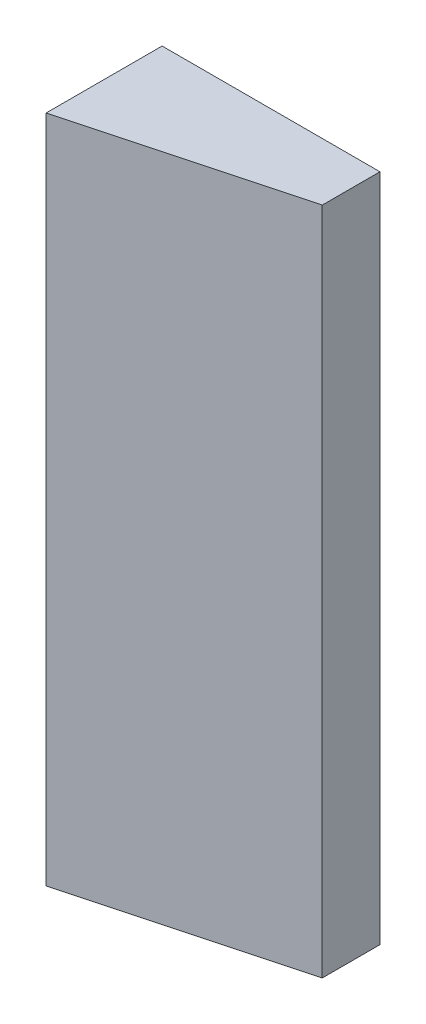
ISO-10303-21;
HEADER;
FILE_DESCRIPTION(('STEP AP214'),'2;1');
FILE_NAME('part.step','',(''),(''),'','','');
FILE_SCHEMA(('AUTOMOTIVE_DESIGN { 1 0 10303 214 1 1 1 1 }'));
ENDSEC;
DATA;
#1=APPLICATION_CONTEXT('core data for automotive mechanical design processes');
#2=APPLICATION_PROTOCOL_DEFINITION('international standard','automotive_design',2000,#1);
#3=PRODUCT_CONTEXT('',#1,'mechanical');
#4=PRODUCT('Part','Part','',(#3));
#5=PRODUCT_RELATED_PRODUCT_CATEGORY('part','',(#4));
#6=PRODUCT_DEFINITION_FORMATION('','',#4);
#7=PRODUCT_DEFINITION_CONTEXT('part definition',#1,'design');
#8=PRODUCT_DEFINITION('design','',#6,#7);
#9=PRODUCT_DEFINITION_SHAPE('','',#8);
#10=(LENGTH_UNIT() NAMED_UNIT(*) SI_UNIT(.MILLI.,.METRE.));
#11=(NAMED_UNIT(*) PLANE_ANGLE_UNIT() SI_UNIT($,.RADIAN.));
#12=(NAMED_UNIT(*) SI_UNIT($,.STERADIAN.) SOLID_ANGLE_UNIT());
#13=UNCERTAINTY_MEASURE_WITH_UNIT(LENGTH_MEASURE(1.E-05),#10,'distance_accuracy_value','');
#14=(GEOMETRIC_REPRESENTATION_CONTEXT(3) GLOBAL_UNCERTAINTY_ASSIGNED_CONTEXT((#13)) GLOBAL_UNIT_ASSIGNED_CONTEXT((#10,
#11,#12)) REPRESENTATION_CONTEXT('',''));
#15=CARTESIAN_POINT('',(0.,0.,0.));
#16=DIRECTION('',(0.,0.,1.));
#17=DIRECTION('',(1.,0.,0.));
#18=AXIS2_PLACEMENT_3D('',#15,#16,#17);
#19=CARTESIAN_POINT('',(0.,-23.2,4.));
#20=DIRECTION('',(0.,1.,0.));
#21=DIRECTION('',(0.,0.,1.));
#22=AXIS2_PLACEMENT_3D('',#19,#20,#21);
#23=PLANE('',#22);
#24=DIRECTION('',(1.,0.,0.));
#25=VECTOR('',#24,1.);
#26=CARTESIAN_POINT('',(0.,-23.2,0.));
#27=LINE('',#26,#25);
#28=CARTESIAN_POINT('',(-7.55,-23.2,0.));
#29=VERTEX_POINT('',#28);
#30=CARTESIAN_POINT('',(7.55000000000001,-23.2,0.));
#31=VERTEX_POINT('',#30);
#32=EDGE_CURVE('E128',#29,#31,#27,.T.);
#33=ORIENTED_EDGE('',*,*,#32,.T.);
#34=DIRECTION('',(0.,0.,-1.));
#35=VECTOR('',#34,1.);
#36=CARTESIAN_POINT('',(7.55000000000001,-23.2,4.));
#37=LINE('',#36,#35);
#38=CARTESIAN_POINT('',(7.55000000000001,-23.2,4.));
#39=VERTEX_POINT('',#38);
#40=EDGE_CURVE('E11',#39,#31,#37,.T.);
#41=ORIENTED_EDGE('',*,*,#40,.F.);
#42=DIRECTION('',(-0.96592582628907,0.,0.258819045102514));
#43=VECTOR('',#42,1.);
#44=CARTESIAN_POINT('',(7.55000000000001,-23.2,4.));
#45=LINE('',#44,#43);
#46=CARTESIAN_POINT('',(-7.55,-23.2,8.04603280570985));
#47=VERTEX_POINT('',#46);
#48=EDGE_CURVE('E105',#39,#47,#45,.T.);
#49=ORIENTED_EDGE('',*,*,#48,.T.);
#50=DIRECTION('',(0.,0.,-1.));
#51=VECTOR('',#50,1.);
#52=CARTESIAN_POINT('',(-7.55,-23.2,4.));
#53=LINE('',#52,#51);
#54=EDGE_CURVE('E58',#47,#29,#53,.T.);
#55=ORIENTED_EDGE('',*,*,#54,.T.);
#56=EDGE_LOOP('',(#33,#41,#49,#55));
#57=FACE_BOUND('',#56,.T.);
#58=ADVANCED_FACE('F41',(#57),#23,.F.);
#59=CARTESIAN_POINT('',(7.55000000000001,0.,4.));
#60=DIRECTION('',(-1.,0.,0.));
#61=DIRECTION('',(0.,-1.,0.));
#62=AXIS2_PLACEMENT_3D('',#59,#60,#61);
#63=PLANE('',#62);
#64=DIRECTION('',(0.,1.,0.));
#65=VECTOR('',#64,1.);
#66=CARTESIAN_POINT('',(7.55000000000001,0.,0.));
#67=LINE('',#66,#65);
#68=CARTESIAN_POINT('',(7.55000000000001,23.2,0.));
#69=VERTEX_POINT('',#68);
#70=EDGE_CURVE('E131',#31,#69,#67,.T.);
#71=ORIENTED_EDGE('',*,*,#70,.T.);
#72=DIRECTION('',(0.,0.,-1.));
#73=VECTOR('',#72,1.);
#74=CARTESIAN_POINT('',(7.55000000000001,23.2,4.));
#75=LINE('',#74,#73);
#76=CARTESIAN_POINT('',(7.55000000000001,23.2,4.));
#77=VERTEX_POINT('',#76);
#78=EDGE_CURVE('E50',#77,#69,#75,.T.);
#79=ORIENTED_EDGE('',*,*,#78,.F.);
#80=DIRECTION('',(0.,1.,0.));
#81=VECTOR('',#80,1.);
#82=CARTESIAN_POINT('',(7.55000000000001,0.,4.));
#83=LINE('',#82,#81);
#84=EDGE_CURVE('E102',#39,#77,#83,.T.);
#85=ORIENTED_EDGE('',*,*,#84,.F.);
#86=ORIENTED_EDGE('',*,*,#40,.T.);
#87=EDGE_LOOP('',(#71,#79,#85,#86));
#88=FACE_BOUND('',#87,.T.);
#89=ADVANCED_FACE('F180',(#88),#63,.F.);
#90=CARTESIAN_POINT('',(0.,23.2,4.));
#91=DIRECTION('',(0.,1.,0.));
#92=DIRECTION('',(0.,0.,1.));
#93=AXIS2_PLACEMENT_3D('',#90,#91,#92);
#94=PLANE('',#93);
#95=DIRECTION('',(1.,0.,0.));
#96=VECTOR('',#95,1.);
#97=CARTESIAN_POINT('',(0.,23.2,0.));
#98=LINE('',#97,#96);
#99=CARTESIAN_POINT('',(-7.55,23.2,0.));
#100=VERTEX_POINT('',#99);
#101=EDGE_CURVE('E89',#100,#69,#98,.T.);
#102=ORIENTED_EDGE('',*,*,#101,.F.);
#103=DIRECTION('',(0.,0.,-1.));
#104=VECTOR('',#103,1.);
#105=CARTESIAN_POINT('',(-7.55,23.2,4.));
#106=LINE('',#105,#104);
#107=CARTESIAN_POINT('',(-7.55,23.2,8.04603280570985));
#108=VERTEX_POINT('',#107);
#109=EDGE_CURVE('E66',#108,#100,#106,.T.);
#110=ORIENTED_EDGE('',*,*,#109,.F.);
#111=DIRECTION('',(-0.96592582628907,0.,0.258819045102514));
#112=VECTOR('',#111,1.);
#113=CARTESIAN_POINT('',(7.55000000000001,23.2,4.));
#114=LINE('',#113,#112);
#115=EDGE_CURVE('E86',#77,#108,#114,.T.);
#116=ORIENTED_EDGE('',*,*,#115,.F.);
#117=ORIENTED_EDGE('',*,*,#78,.T.);
#118=EDGE_LOOP('',(#102,#110,#116,#117));
#119=FACE_BOUND('',#118,.T.);
#120=ADVANCED_FACE('F84',(#119),#94,.T.);
#121=CARTESIAN_POINT('',(-7.55,0.,4.));
#122=DIRECTION('',(-1.,0.,0.));
#123=DIRECTION('',(0.,0.,1.));
#124=AXIS2_PLACEMENT_3D('',#121,#122,#123);
#125=PLANE('',#124);
#126=DIRECTION('',(0.,1.,0.));
#127=VECTOR('',#126,1.);
#128=CARTESIAN_POINT('',(-7.55,0.,0.));
#129=LINE('',#128,#127);
#130=EDGE_CURVE('E127',#29,#100,#129,.T.);
#131=ORIENTED_EDGE('',*,*,#130,.F.);
#132=ORIENTED_EDGE('',*,*,#54,.F.);
#133=DIRECTION('',(0.,-1.,0.));
#134=VECTOR('',#133,1.);
#135=CARTESIAN_POINT('',(-7.55,38.8326703241922,8.04603280570985));
#136=LINE('',#135,#134);
#137=EDGE_CURVE('E94',#108,#47,#136,.T.);
#138=ORIENTED_EDGE('',*,*,#137,.F.);
#139=ORIENTED_EDGE('',*,*,#109,.T.);
#140=EDGE_LOOP('',(#131,#132,#138,#139));
#141=FACE_BOUND('',#140,.T.);
#142=ADVANCED_FACE('F95',(#141),#125,.T.);
#143=CARTESIAN_POINT('',(0.,0.,0.));
#144=DIRECTION('',(0.,0.,1.));
#145=DIRECTION('',(1.,0.,0.));
#146=AXIS2_PLACEMENT_3D('',#143,#144,#145);
#147=PLANE('',#146);
#148=CARTESIAN_POINT('',(-4.55,20.2,0.));
#149=DIRECTION('',(0.,0.,1.));
#150=DIRECTION('',(1.,0.,0.));
#151=AXIS2_PLACEMENT_3D('',#148,#149,#150);
#152=CIRCLE('',#151,0.899999999999998);
#153=CARTESIAN_POINT('',(-3.65,20.2,0.));
#154=VERTEX_POINT('',#153);
#155=EDGE_CURVE('E44',#154,#154,#152,.T.);
#156=ORIENTED_EDGE('',*,*,#155,.T.);
#157=EDGE_LOOP('',(#156));
#158=FACE_BOUND('',#157,.T.);
#159=CARTESIAN_POINT('',(4.55,20.2,0.));
#160=DIRECTION('',(0.,0.,1.));
#161=DIRECTION('',(1.,0.,0.));
#162=AXIS2_PLACEMENT_3D('',#159,#160,#161);
#163=CIRCLE('',#162,0.899999999999998);
#164=CARTESIAN_POINT('',(5.45,20.2,0.));
#165=VERTEX_POINT('',#164);
#166=EDGE_CURVE('E150',#165,#165,#163,.T.);
#167=ORIENTED_EDGE('',*,*,#166,.T.);
#168=EDGE_LOOP('',(#167));
#169=FACE_BOUND('',#168,.T.);
#170=CARTESIAN_POINT('',(4.55,-20.2,0.));
#171=DIRECTION('',(0.,0.,1.));
#172=DIRECTION('',(1.,0.,0.));
#173=AXIS2_PLACEMENT_3D('',#170,#171,#172);
#174=CIRCLE('',#173,0.899999999999998);
#175=CARTESIAN_POINT('',(5.45,-20.2,0.));
#176=VERTEX_POINT('',#175);
#177=EDGE_CURVE('E147',#176,#176,#174,.T.);
#178=ORIENTED_EDGE('',*,*,#177,.T.);
#179=EDGE_LOOP('',(#178));
#180=FACE_BOUND('',#179,.T.);
#181=CARTESIAN_POINT('',(-4.55,-20.2,0.));
#182=DIRECTION('',(0.,0.,1.));
#183=DIRECTION('',(1.,0.,0.));
#184=AXIS2_PLACEMENT_3D('',#181,#182,#183);
#185=CIRCLE('',#184,0.899999999999998);
#186=CARTESIAN_POINT('',(-3.65,-20.2,0.));
#187=VERTEX_POINT('',#186);
#188=EDGE_CURVE('E132',#187,#187,#185,.T.);
#189=ORIENTED_EDGE('',*,*,#188,.T.);
#190=EDGE_LOOP('',(#189));
#191=FACE_BOUND('',#190,.T.);
#192=ORIENTED_EDGE('',*,*,#32,.F.);
#193=ORIENTED_EDGE('',*,*,#130,.T.);
#194=ORIENTED_EDGE('',*,*,#101,.T.);
#195=ORIENTED_EDGE('',*,*,#70,.F.);
#196=EDGE_LOOP('',(#192,#193,#194,#195));
#197=FACE_BOUND('',#196,.T.);
#198=ADVANCED_FACE('F159',(#158,#169,#180,#191,#197),#147,.F.);
#199=CARTESIAN_POINT('',(-4.55,-20.2,4.));
#200=DIRECTION('',(0.,0.,1.));
#201=DIRECTION('',(1.,0.,0.));
#202=AXIS2_PLACEMENT_3D('',#199,#200,#201);
#203=CYLINDRICAL_SURFACE('',#202,0.899999999999998);
#204=CARTESIAN_POINT('',(-4.55,-20.2,4.));
#205=DIRECTION('',(0.,0.,1.));
#206=DIRECTION('',(1.,0.,0.));
#207=AXIS2_PLACEMENT_3D('',#204,#205,#206);
#208=CIRCLE('',#207,0.899999999999999);
#209=CARTESIAN_POINT('',(-3.65,-20.2,4.));
#210=VERTEX_POINT('',#209);
#211=EDGE_CURVE('E98',#210,#210,#208,.T.);
#212=ORIENTED_EDGE('',*,*,#211,.T.);
#213=EDGE_LOOP('',(#212));
#214=FACE_BOUND('',#213,.T.);
#215=ORIENTED_EDGE('',*,*,#188,.F.);
#216=EDGE_LOOP('',(#215));
#217=FACE_BOUND('',#216,.T.);
#218=ADVANCED_FACE('F188',(#214,#217),#203,.F.);
#219=CARTESIAN_POINT('',(4.55,-20.2,4.));
#220=DIRECTION('',(0.,0.,1.));
#221=DIRECTION('',(1.,0.,0.));
#222=AXIS2_PLACEMENT_3D('',#219,#220,#221);
#223=CYLINDRICAL_SURFACE('',#222,0.899999999999998);
#224=CARTESIAN_POINT('',(4.55,-20.2,4.));
#225=DIRECTION('',(0.,0.,1.));
#226=DIRECTION('',(1.,0.,0.));
#227=AXIS2_PLACEMENT_3D('',#224,#225,#226);
#228=CIRCLE('',#227,0.899999999999999);
#229=CARTESIAN_POINT('',(5.45,-20.2,4.));
#230=VERTEX_POINT('',#229);
#231=EDGE_CURVE('E118',#230,#230,#228,.T.);
#232=ORIENTED_EDGE('',*,*,#231,.T.);
#233=EDGE_LOOP('',(#232));
#234=FACE_BOUND('',#233,.T.);
#235=ORIENTED_EDGE('',*,*,#177,.F.);
#236=EDGE_LOOP('',(#235));
#237=FACE_BOUND('',#236,.T.);
#238=ADVANCED_FACE('F175',(#234,#237),#223,.F.);
#239=CARTESIAN_POINT('',(4.55,20.2,4.));
#240=DIRECTION('',(0.,0.,1.));
#241=DIRECTION('',(1.,0.,0.));
#242=AXIS2_PLACEMENT_3D('',#239,#240,#241);
#243=CYLINDRICAL_SURFACE('',#242,0.899999999999998);
#244=CARTESIAN_POINT('',(4.55,20.2,4.));
#245=DIRECTION('',(0.,0.,1.));
#246=DIRECTION('',(1.,0.,0.));
#247=AXIS2_PLACEMENT_3D('',#244,#245,#246);
#248=CIRCLE('',#247,0.899999999999999);
#249=CARTESIAN_POINT('',(5.45,20.2,4.));
#250=VERTEX_POINT('',#249);
#251=EDGE_CURVE('E114',#250,#250,#248,.T.);
#252=ORIENTED_EDGE('',*,*,#251,.T.);
#253=EDGE_LOOP('',(#252));
#254=FACE_BOUND('',#253,.T.);
#255=ORIENTED_EDGE('',*,*,#166,.F.);
#256=EDGE_LOOP('',(#255));
#257=FACE_BOUND('',#256,.T.);
#258=ADVANCED_FACE('F164',(#254,#257),#243,.F.);
#259=CARTESIAN_POINT('',(-4.55,20.2,4.));
#260=DIRECTION('',(0.,0.,1.));
#261=DIRECTION('',(1.,0.,0.));
#262=AXIS2_PLACEMENT_3D('',#259,#260,#261);
#263=CYLINDRICAL_SURFACE('',#262,0.899999999999998);
#264=CARTESIAN_POINT('',(-4.55,20.2,4.));
#265=DIRECTION('',(0.,0.,1.));
#266=DIRECTION('',(1.,0.,0.));
#267=AXIS2_PLACEMENT_3D('',#264,#265,#266);
#268=CIRCLE('',#267,0.899999999999999);
#269=CARTESIAN_POINT('',(-3.65,20.2,4.));
#270=VERTEX_POINT('',#269);
#271=EDGE_CURVE('E110',#270,#270,#268,.T.);
#272=ORIENTED_EDGE('',*,*,#271,.T.);
#273=EDGE_LOOP('',(#272));
#274=FACE_BOUND('',#273,.T.);
#275=ORIENTED_EDGE('',*,*,#155,.F.);
#276=EDGE_LOOP('',(#275));
#277=FACE_BOUND('',#276,.T.);
#278=ADVANCED_FACE('F161',(#274,#277),#263,.F.);
#279=CARTESIAN_POINT('',(7.55000000000001,38.8326703241922,4.));
#280=DIRECTION('',(0.,0.,-1.));
#281=DIRECTION('',(-1.,0.,0.));
#282=AXIS2_PLACEMENT_3D('',#279,#280,#281);
#283=PLANE('',#282);
#284=ORIENTED_EDGE('',*,*,#211,.F.);
#285=EDGE_LOOP('',(#284));
#286=FACE_BOUND('',#285,.T.);
#287=ADVANCED_FACE('F163',(#286),#283,.T.);
#288=ORIENTED_EDGE('',*,*,#231,.F.);
#289=EDGE_LOOP('',(#288));
#290=FACE_BOUND('',#289,.T.);
#291=ADVANCED_FACE('F171',(#290),#283,.T.);
#292=ORIENTED_EDGE('',*,*,#251,.F.);
#293=EDGE_LOOP('',(#292));
#294=FACE_BOUND('',#293,.T.);
#295=ADVANCED_FACE('F224',(#294),#283,.T.);
#296=ORIENTED_EDGE('',*,*,#271,.F.);
#297=EDGE_LOOP('',(#296));
#298=FACE_BOUND('',#297,.T.);
#299=ADVANCED_FACE('F174',(#298),#283,.T.);
#300=CARTESIAN_POINT('',(7.55000000000001,38.8326703241922,4.));
#301=DIRECTION('',(0.258819045102514,0.,0.96592582628907));
#302=DIRECTION('',(0.96592582628907,0.,-0.258819045102514));
#303=AXIS2_PLACEMENT_3D('',#300,#301,#302);
#304=PLANE('',#303);
#305=ORIENTED_EDGE('',*,*,#84,.T.);
#306=ORIENTED_EDGE('',*,*,#115,.T.);
#307=ORIENTED_EDGE('',*,*,#137,.T.);
#308=ORIENTED_EDGE('',*,*,#48,.F.);
#309=EDGE_LOOP('',(#305,#306,#307,#308));
#310=FACE_BOUND('',#309,.T.);
#311=ADVANCED_FACE('F100',(#310),#304,.T.);
#312=CLOSED_SHELL('',(#58,#89,#120,#142,#198,#218,#238,#258,#278,#287,#291,#295,#299,#311));
#313=MANIFOLD_SOLID_BREP('B2',#312);
#314=ADVANCED_BREP_SHAPE_REPRESENTATION('',(#18,#313),#14);
#315=SHAPE_DEFINITION_REPRESENTATION(#9,#314);
ENDSEC;
END-ISO-10303-21;
